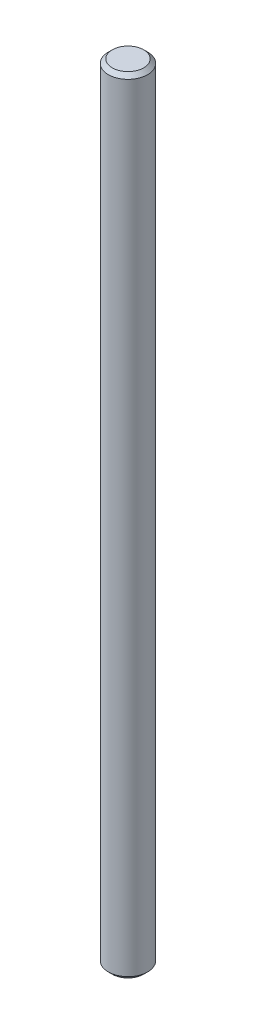
ISO-10303-21;
HEADER;
FILE_DESCRIPTION(('STEP AP214'),'2;1');
FILE_NAME('part.step','',(''),(''),'','','');
FILE_SCHEMA(('AUTOMOTIVE_DESIGN { 1 0 10303 214 1 1 1 1 }'));
ENDSEC;
DATA;
#1=APPLICATION_CONTEXT('core data for automotive mechanical design processes');
#2=APPLICATION_PROTOCOL_DEFINITION('international standard','automotive_design',2000,#1);
#3=PRODUCT_CONTEXT('',#1,'mechanical');
#4=PRODUCT('Part','Part','',(#3));
#5=PRODUCT_RELATED_PRODUCT_CATEGORY('part','',(#4));
#6=PRODUCT_DEFINITION_FORMATION('','',#4);
#7=PRODUCT_DEFINITION_CONTEXT('part definition',#1,'design');
#8=PRODUCT_DEFINITION('design','',#6,#7);
#9=PRODUCT_DEFINITION_SHAPE('','',#8);
#10=(LENGTH_UNIT() NAMED_UNIT(*) SI_UNIT(.MILLI.,.METRE.));
#11=(NAMED_UNIT(*) PLANE_ANGLE_UNIT() SI_UNIT($,.RADIAN.));
#12=(NAMED_UNIT(*) SI_UNIT($,.STERADIAN.) SOLID_ANGLE_UNIT());
#13=UNCERTAINTY_MEASURE_WITH_UNIT(LENGTH_MEASURE(1.E-05),#10,'distance_accuracy_value','');
#14=(GEOMETRIC_REPRESENTATION_CONTEXT(3) GLOBAL_UNCERTAINTY_ASSIGNED_CONTEXT((#13)) GLOBAL_UNIT_ASSIGNED_CONTEXT((#10,
#11,#12)) REPRESENTATION_CONTEXT('',''));
#15=CARTESIAN_POINT('',(0.,0.,0.));
#16=DIRECTION('',(0.,0.,1.));
#17=DIRECTION('',(1.,0.,0.));
#18=AXIS2_PLACEMENT_3D('',#15,#16,#17);
#19=CARTESIAN_POINT('',(0.,200.,0.));
#20=DIRECTION('',(0.,-1.,0.));
#21=DIRECTION('',(0.,0.,-1.));
#22=AXIS2_PLACEMENT_3D('',#19,#20,#21);
#23=CYLINDRICAL_SURFACE('',#22,5.);
#24=CARTESIAN_POINT('',(0.,0.999999999999945,0.));
#25=DIRECTION('',(0.,1.,0.));
#26=DIRECTION('',(0.,0.,1.));
#27=AXIS2_PLACEMENT_3D('',#24,#25,#26);
#28=CIRCLE('',#27,5.);
#29=CARTESIAN_POINT('',(0.,0.999999999999945,5.));
#30=VERTEX_POINT('',#29);
#31=EDGE_CURVE('E44',#30,#30,#28,.T.);
#32=ORIENTED_EDGE('',*,*,#31,.T.);
#33=EDGE_LOOP('',(#32));
#34=FACE_BOUND('',#33,.T.);
#35=CARTESIAN_POINT('',(0.,199.,0.));
#36=DIRECTION('',(0.,1.,0.));
#37=DIRECTION('',(0.,0.,1.));
#38=AXIS2_PLACEMENT_3D('',#35,#36,#37);
#39=CIRCLE('',#38,5.);
#40=CARTESIAN_POINT('',(0.,199.,5.));
#41=VERTEX_POINT('',#40);
#42=EDGE_CURVE('E48',#41,#41,#39,.F.);
#43=ORIENTED_EDGE('',*,*,#42,.T.);
#44=EDGE_LOOP('',(#43));
#45=FACE_BOUND('',#44,.T.);
#46=ADVANCED_FACE('F33',(#34,#45),#23,.T.);
#47=CARTESIAN_POINT('',(0.,200.,0.));
#48=DIRECTION('',(0.,1.,0.));
#49=DIRECTION('',(0.,0.,1.));
#50=AXIS2_PLACEMENT_3D('',#47,#48,#49);
#51=PLANE('',#50);
#52=CARTESIAN_POINT('',(0.,200.,0.));
#53=DIRECTION('',(0.,1.,0.));
#54=DIRECTION('',(0.,0.,1.));
#55=AXIS2_PLACEMENT_3D('',#52,#53,#54);
#56=CIRCLE('',#55,4.);
#57=CARTESIAN_POINT('',(0.,200.,4.));
#58=VERTEX_POINT('',#57);
#59=EDGE_CURVE('E10',#58,#58,#56,.T.);
#60=ORIENTED_EDGE('',*,*,#59,.T.);
#61=EDGE_LOOP('',(#60));
#62=FACE_BOUND('',#61,.T.);
#63=ADVANCED_FACE('F64',(#62),#51,.T.);
#64=CARTESIAN_POINT('',(0.,0.,0.));
#65=DIRECTION('',(0.,1.,0.));
#66=DIRECTION('',(0.,0.,1.));
#67=AXIS2_PLACEMENT_3D('',#64,#65,#66);
#68=PLANE('',#67);
#69=CARTESIAN_POINT('',(0.,0.,0.));
#70=DIRECTION('',(0.,1.,0.));
#71=DIRECTION('',(0.,0.,1.));
#72=AXIS2_PLACEMENT_3D('',#69,#70,#71);
#73=CIRCLE('',#72,4.00000000000003);
#74=CARTESIAN_POINT('',(0.,0.,4.00000000000003));
#75=VERTEX_POINT('',#74);
#76=EDGE_CURVE('E40',#75,#75,#73,.F.);
#77=ORIENTED_EDGE('',*,*,#76,.T.);
#78=EDGE_LOOP('',(#77));
#79=FACE_BOUND('',#78,.T.);
#80=ADVANCED_FACE('F61',(#79),#68,.F.);
#81=CARTESIAN_POINT('',(0.,0.999999999999945,0.));
#82=DIRECTION('',(0.,1.,0.));
#83=DIRECTION('',(0.,0.,1.));
#84=AXIS2_PLACEMENT_3D('',#81,#82,#83);
#85=CONICAL_SURFACE('',#84,5.,0.78539816339746);
#86=ORIENTED_EDGE('',*,*,#76,.F.);
#87=EDGE_LOOP('',(#86));
#88=FACE_BOUND('',#87,.T.);
#89=ORIENTED_EDGE('',*,*,#31,.F.);
#90=EDGE_LOOP('',(#89));
#91=FACE_BOUND('',#90,.T.);
#92=ADVANCED_FACE('F57',(#88,#91),#85,.T.);
#93=CARTESIAN_POINT('',(0.,200.,0.));
#94=DIRECTION('',(0.,-1.,0.));
#95=DIRECTION('',(0.,0.,-1.));
#96=AXIS2_PLACEMENT_3D('',#93,#94,#95);
#97=CONICAL_SURFACE('',#96,4.,0.78539816339746);
#98=ORIENTED_EDGE('',*,*,#42,.F.);
#99=EDGE_LOOP('',(#98));
#100=FACE_BOUND('',#99,.T.);
#101=ORIENTED_EDGE('',*,*,#59,.F.);
#102=EDGE_LOOP('',(#101));
#103=FACE_BOUND('',#102,.T.);
#104=ADVANCED_FACE('F35',(#100,#103),#97,.T.);
#105=CLOSED_SHELL('',(#46,#63,#80,#92,#104));
#106=MANIFOLD_SOLID_BREP('B2',#105);
#107=ADVANCED_BREP_SHAPE_REPRESENTATION('',(#18,#106),#14);
#108=SHAPE_DEFINITION_REPRESENTATION(#9,#107);
ENDSEC;
END-ISO-10303-21;
